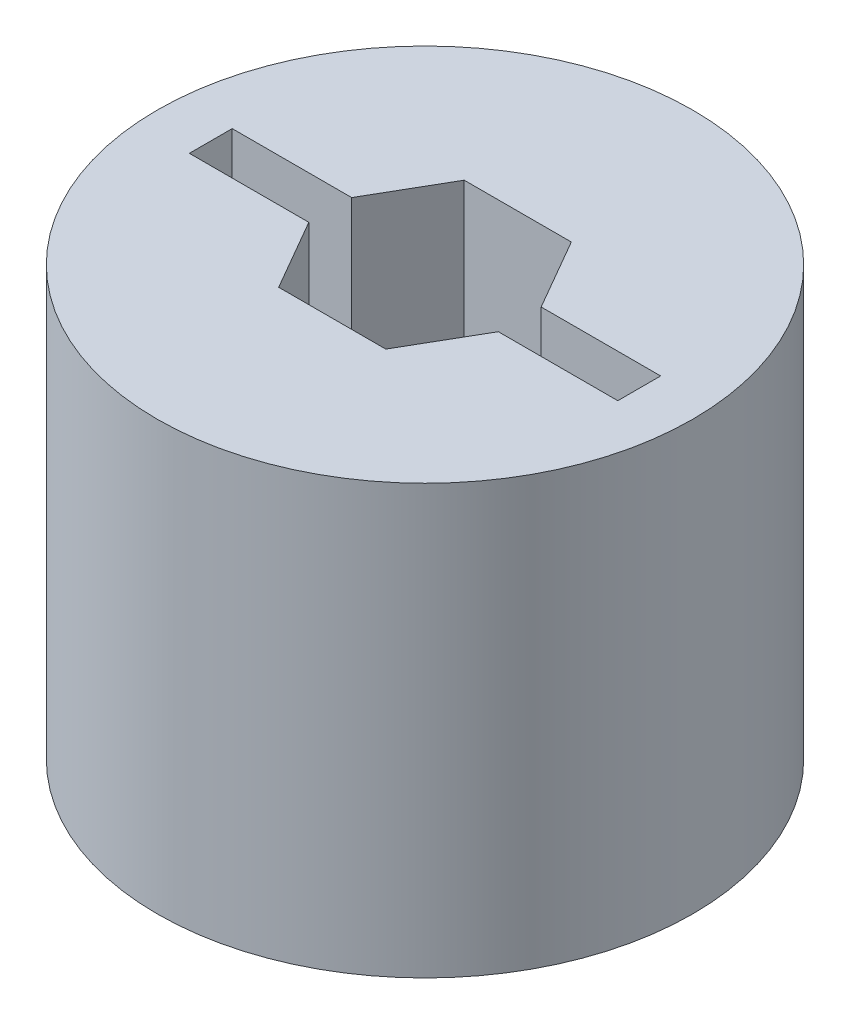
ISO-10303-21;
HEADER;
FILE_DESCRIPTION(('STEP AP214'),'2;1');
FILE_NAME('part.step','',(''),(''),'','','');
FILE_SCHEMA(('AUTOMOTIVE_DESIGN { 1 0 10303 214 1 1 1 1 }'));
ENDSEC;
DATA;
#1=APPLICATION_CONTEXT('core data for automotive mechanical design processes');
#2=APPLICATION_PROTOCOL_DEFINITION('international standard','automotive_design',2000,#1);
#3=PRODUCT_CONTEXT('',#1,'mechanical');
#4=PRODUCT('Part','Part','',(#3));
#5=PRODUCT_RELATED_PRODUCT_CATEGORY('part','',(#4));
#6=PRODUCT_DEFINITION_FORMATION('','',#4);
#7=PRODUCT_DEFINITION_CONTEXT('part definition',#1,'design');
#8=PRODUCT_DEFINITION('design','',#6,#7);
#9=PRODUCT_DEFINITION_SHAPE('','',#8);
#10=(LENGTH_UNIT() NAMED_UNIT(*) SI_UNIT(.MILLI.,.METRE.));
#11=(NAMED_UNIT(*) PLANE_ANGLE_UNIT() SI_UNIT($,.RADIAN.));
#12=(NAMED_UNIT(*) SI_UNIT($,.STERADIAN.) SOLID_ANGLE_UNIT());
#13=UNCERTAINTY_MEASURE_WITH_UNIT(LENGTH_MEASURE(1.E-05),#10,'distance_accuracy_value','');
#14=(GEOMETRIC_REPRESENTATION_CONTEXT(3) GLOBAL_UNCERTAINTY_ASSIGNED_CONTEXT((#13)) GLOBAL_UNIT_ASSIGNED_CONTEXT((#10,
#11,#12)) REPRESENTATION_CONTEXT('',''));
#15=CARTESIAN_POINT('',(0.,0.,0.));
#16=DIRECTION('',(0.,0.,1.));
#17=DIRECTION('',(1.,0.,0.));
#18=AXIS2_PLACEMENT_3D('',#15,#16,#17);
#19=CARTESIAN_POINT('',(0.,25.4,0.));
#20=DIRECTION('',(0.,-1.,0.));
#21=DIRECTION('',(0.,0.,-1.));
#22=AXIS2_PLACEMENT_3D('',#19,#20,#21);
#23=CYLINDRICAL_SURFACE('',#22,15.875);
#24=CARTESIAN_POINT('',(0.,25.4,0.));
#25=DIRECTION('',(0.,1.,0.));
#26=DIRECTION('',(0.,0.,1.));
#27=AXIS2_PLACEMENT_3D('',#24,#25,#26);
#28=CIRCLE('',#27,15.875);
#29=CARTESIAN_POINT('',(0.,25.4,-15.875));
#30=VERTEX_POINT('',#29);
#31=EDGE_CURVE('E11',#30,#30,#28,.T.);
#32=CARTESIAN_POINT('',(0.,0.,0.));
#33=DIRECTION('',(0.,1.,0.));
#34=DIRECTION('',(0.,0.,1.));
#35=AXIS2_PLACEMENT_3D('',#32,#33,#34);
#36=CIRCLE('',#35,15.875);
#37=CARTESIAN_POINT('',(0.,0.,-15.875));
#38=VERTEX_POINT('',#37);
#39=EDGE_CURVE('E35',#38,#38,#36,.T.);
#40=CARTESIAN_POINT('',(0.,25.4,-15.875));
#41=CARTESIAN_POINT('',(0.,25.1354166666667,-15.875));
#42=CARTESIAN_POINT('',(0.,24.8708333333333,-15.875));
#43=CARTESIAN_POINT('',(0.,24.3416666666667,-15.875));
#44=CARTESIAN_POINT('',(0.,24.0770833333333,-15.875));
#45=CARTESIAN_POINT('',(0.,23.5479166666667,-15.875));
#46=CARTESIAN_POINT('',(0.,23.2833333333333,-15.875));
#47=CARTESIAN_POINT('',(0.,22.7541666666667,-15.875));
#48=CARTESIAN_POINT('',(0.,22.4895833333333,-15.875));
#49=CARTESIAN_POINT('',(0.,21.9604166666667,-15.875));
#50=CARTESIAN_POINT('',(0.,21.6958333333333,-15.875));
#51=CARTESIAN_POINT('',(0.,21.1666666666667,-15.875));
#52=CARTESIAN_POINT('',(0.,20.9020833333333,-15.875));
#53=CARTESIAN_POINT('',(0.,20.3729166666667,-15.875));
#54=CARTESIAN_POINT('',(0.,20.1083333333333,-15.875));
#55=CARTESIAN_POINT('',(0.,19.5791666666667,-15.875));
#56=CARTESIAN_POINT('',(0.,19.3145833333333,-15.875));
#57=CARTESIAN_POINT('',(0.,18.7854166666667,-15.875));
#58=CARTESIAN_POINT('',(0.,18.5208333333333,-15.875));
#59=CARTESIAN_POINT('',(0.,17.9916666666667,-15.875));
#60=CARTESIAN_POINT('',(0.,17.7270833333333,-15.875));
#61=CARTESIAN_POINT('',(0.,17.1979166666667,-15.875));
#62=CARTESIAN_POINT('',(0.,16.9333333333333,-15.875));
#63=CARTESIAN_POINT('',(0.,16.4041666666667,-15.875));
#64=CARTESIAN_POINT('',(0.,16.1395833333333,-15.875));
#65=CARTESIAN_POINT('',(0.,15.6104166666667,-15.875));
#66=CARTESIAN_POINT('',(0.,15.3458333333333,-15.875));
#67=CARTESIAN_POINT('',(0.,14.8166666666667,-15.875));
#68=CARTESIAN_POINT('',(0.,14.5520833333333,-15.875));
#69=CARTESIAN_POINT('',(0.,14.0229166666667,-15.875));
#70=CARTESIAN_POINT('',(0.,13.7583333333333,-15.875));
#71=CARTESIAN_POINT('',(0.,13.2291666666667,-15.875));
#72=CARTESIAN_POINT('',(0.,12.9645833333333,-15.875));
#73=CARTESIAN_POINT('',(0.,12.4354166666667,-15.875));
#74=CARTESIAN_POINT('',(0.,12.1708333333333,-15.875));
#75=CARTESIAN_POINT('',(0.,11.6416666666667,-15.875));
#76=CARTESIAN_POINT('',(0.,11.3770833333333,-15.875));
#77=CARTESIAN_POINT('',(0.,10.8479166666667,-15.875));
#78=CARTESIAN_POINT('',(0.,10.5833333333333,-15.875));
#79=CARTESIAN_POINT('',(0.,10.0541666666667,-15.875));
#80=CARTESIAN_POINT('',(0.,9.78958333333334,-15.875));
#81=CARTESIAN_POINT('',(0.,9.26041666666667,-15.875));
#82=CARTESIAN_POINT('',(0.,8.99583333333333,-15.875));
#83=CARTESIAN_POINT('',(0.,8.46666666666667,-15.875));
#84=CARTESIAN_POINT('',(0.,8.20208333333333,-15.875));
#85=CARTESIAN_POINT('',(0.,7.67291666666667,-15.875));
#86=CARTESIAN_POINT('',(0.,7.40833333333333,-15.875));
#87=CARTESIAN_POINT('',(0.,6.87916666666667,-15.875));
#88=CARTESIAN_POINT('',(0.,6.61458333333333,-15.875));
#89=CARTESIAN_POINT('',(0.,6.08541666666667,-15.875));
#90=CARTESIAN_POINT('',(0.,5.82083333333333,-15.875));
#91=CARTESIAN_POINT('',(0.,5.29166666666667,-15.875));
#92=CARTESIAN_POINT('',(0.,5.02708333333333,-15.875));
#93=CARTESIAN_POINT('',(0.,4.49791666666667,-15.875));
#94=CARTESIAN_POINT('',(0.,4.23333333333333,-15.875));
#95=CARTESIAN_POINT('',(0.,3.70416666666667,-15.875));
#96=CARTESIAN_POINT('',(0.,3.43958333333333,-15.875));
#97=CARTESIAN_POINT('',(0.,2.91041666666667,-15.875));
#98=CARTESIAN_POINT('',(0.,2.64583333333333,-15.875));
#99=CARTESIAN_POINT('',(0.,2.11666666666667,-15.875));
#100=CARTESIAN_POINT('',(0.,1.85208333333333,-15.875));
#101=CARTESIAN_POINT('',(0.,1.32291666666667,-15.875));
#102=CARTESIAN_POINT('',(0.,1.05833333333333,-15.875));
#103=CARTESIAN_POINT('',(0.,0.529166666666666,-15.875));
#104=CARTESIAN_POINT('',(0.,0.264583333333333,-15.875));
#105=CARTESIAN_POINT('',(0.,0.,-15.875));
#106=B_SPLINE_CURVE_WITH_KNOTS('',3,(#40,#41,#42,#43,#44,#45,#46,#47,#48,#49,#50,#51,#52,#53,
#54,#55,#56,#57,#58,#59,#60,#61,#62,#63,#64,#65,#66,#67,#68,#69,#70,#71,#72,#73,#74,#75,#76,#77,
#78,#79,#80,#81,#82,#83,#84,#85,#86,#87,#88,#89,#90,#91,#92,#93,#94,#95,#96,#97,#98,#99,#100,
#101,#102,#103,#104,#105),.UNSPECIFIED.,.F.,.F.,(4,2,2,2,2,2,2,2,2,2,2,2,2,2,2,2,2,2,2,2,2,2,2,
2,2,2,2,2,2,2,2,2,4),(0.,0.793749999999999,1.5875,2.38125,3.175,3.96875,4.7625,5.55625,6.35,
7.14375,7.9375,8.73125,9.525,10.31875,11.1125,11.90625,12.7,13.49375,14.2875,15.08125,15.875,
16.66875,17.4625,18.25625,19.05,19.84375,20.6375,21.43125,22.225,23.01875,23.8125,24.60625,
25.4),.UNSPECIFIED.);
#107=EDGE_CURVE('BSEAM32',#30,#38,#106,.T.);
#108=ORIENTED_EDGE('',*,*,#31,.F.);
#109=ORIENTED_EDGE('',*,*,#39,.T.);
#110=ORIENTED_EDGE('',*,*,#107,.T.);
#111=ORIENTED_EDGE('',*,*,#107,.F.);
#112=EDGE_LOOP('',(#108,#110,#109,#111));
#113=FACE_BOUND('',#112,.T.);
#114=ADVANCED_FACE('F32',(#113),#23,.T.);
#115=CARTESIAN_POINT('',(0.,25.4,0.));
#116=DIRECTION('',(0.,1.,0.));
#117=DIRECTION('',(0.,0.,1.));
#118=AXIS2_PLACEMENT_3D('',#115,#116,#117);
#119=PLANE('',#118);
#120=DIRECTION('',(1.,0.,0.));
#121=VECTOR('',#120,1.);
#122=CARTESIAN_POINT('',(0.,25.4,1.27));
#123=LINE('',#122,#121);
#124=CARTESIAN_POINT('',(-12.7,25.4,1.27));
#125=VERTEX_POINT('',#124);
#126=CARTESIAN_POINT('',(-5.61676515812917,25.4,1.27));
#127=VERTEX_POINT('',#126);
#128=EDGE_CURVE('E46',#125,#127,#123,.T.);
#129=ORIENTED_EDGE('',*,*,#128,.F.);
#130=DIRECTION('',(0.,0.,-1.));
#131=VECTOR('',#130,1.);
#132=CARTESIAN_POINT('',(-12.7,25.4,0.));
#133=LINE('',#132,#131);
#134=CARTESIAN_POINT('',(-12.7,25.4,-1.27));
#135=VERTEX_POINT('',#134);
#136=EDGE_CURVE('E138',#125,#135,#133,.T.);
#137=ORIENTED_EDGE('',*,*,#136,.T.);
#138=DIRECTION('',(1.,0.,0.));
#139=VECTOR('',#138,1.);
#140=CARTESIAN_POINT('',(0.,25.4,-1.27));
#141=LINE('',#140,#139);
#142=CARTESIAN_POINT('',(-5.61676515812917,25.4,-1.27));
#143=VERTEX_POINT('',#142);
#144=EDGE_CURVE('E141',#135,#143,#141,.T.);
#145=ORIENTED_EDGE('',*,*,#144,.T.);
#146=DIRECTION('',(-0.5,0.,0.866025403784439));
#147=VECTOR('',#146,1.);
#148=CARTESIAN_POINT('',(-4.7625,25.4,-2.74963065701559));
#149=LINE('',#148,#147);
#150=CARTESIAN_POINT('',(-3.175,25.4,-5.49926131403118));
#151=VERTEX_POINT('',#150);
#152=EDGE_CURVE('E192',#151,#143,#149,.T.);
#153=ORIENTED_EDGE('',*,*,#152,.F.);
#154=DIRECTION('',(-1.,0.,0.));
#155=VECTOR('',#154,1.);
#156=CARTESIAN_POINT('',(0.,25.4,-5.49926131403118));
#157=LINE('',#156,#155);
#158=CARTESIAN_POINT('',(3.175,25.4,-5.49926131403118));
#159=VERTEX_POINT('',#158);
#160=EDGE_CURVE('E189',#159,#151,#157,.T.);
#161=ORIENTED_EDGE('',*,*,#160,.F.);
#162=DIRECTION('',(-0.5,0.,-0.866025403784439));
#163=VECTOR('',#162,1.);
#164=CARTESIAN_POINT('',(4.7625,25.4,-2.74963065701559));
#165=LINE('',#164,#163);
#166=CARTESIAN_POINT('',(5.61676515812917,25.4,-1.27));
#167=VERTEX_POINT('',#166);
#168=EDGE_CURVE('E186',#167,#159,#165,.T.);
#169=ORIENTED_EDGE('',*,*,#168,.F.);
#170=DIRECTION('',(1.,0.,0.));
#171=VECTOR('',#170,1.);
#172=CARTESIAN_POINT('',(0.,25.4,-1.27));
#173=LINE('',#172,#171);
#174=CARTESIAN_POINT('',(12.7,25.4,-1.27));
#175=VERTEX_POINT('',#174);
#176=EDGE_CURVE('E183',#167,#175,#173,.T.);
#177=ORIENTED_EDGE('',*,*,#176,.T.);
#178=DIRECTION('',(0.,0.,-1.));
#179=VECTOR('',#178,1.);
#180=CARTESIAN_POINT('',(12.7,25.4,0.));
#181=LINE('',#180,#179);
#182=CARTESIAN_POINT('',(12.7,25.4,1.27));
#183=VERTEX_POINT('',#182);
#184=EDGE_CURVE('E180',#183,#175,#181,.T.);
#185=ORIENTED_EDGE('',*,*,#184,.F.);
#186=DIRECTION('',(1.,0.,0.));
#187=VECTOR('',#186,1.);
#188=CARTESIAN_POINT('',(0.,25.4,1.27));
#189=LINE('',#188,#187);
#190=CARTESIAN_POINT('',(5.61676515812917,25.4,1.27));
#191=VERTEX_POINT('',#190);
#192=EDGE_CURVE('E177',#191,#183,#189,.T.);
#193=ORIENTED_EDGE('',*,*,#192,.F.);
#194=DIRECTION('',(0.5,0.,-0.866025403784439));
#195=VECTOR('',#194,1.);
#196=CARTESIAN_POINT('',(4.7625,25.4,2.74963065701559));
#197=LINE('',#196,#195);
#198=CARTESIAN_POINT('',(3.175,25.4,5.49926131403118));
#199=VERTEX_POINT('',#198);
#200=EDGE_CURVE('E174',#199,#191,#197,.T.);
#201=ORIENTED_EDGE('',*,*,#200,.F.);
#202=DIRECTION('',(1.,0.,0.));
#203=VECTOR('',#202,1.);
#204=CARTESIAN_POINT('',(0.,25.4,5.49926131403118));
#205=LINE('',#204,#203);
#206=CARTESIAN_POINT('',(-3.175,25.4,5.49926131403118));
#207=VERTEX_POINT('',#206);
#208=EDGE_CURVE('E171',#207,#199,#205,.T.);
#209=ORIENTED_EDGE('',*,*,#208,.F.);
#210=DIRECTION('',(0.5,0.,0.866025403784439));
#211=VECTOR('',#210,1.);
#212=CARTESIAN_POINT('',(-4.7625,25.4,2.74963065701559));
#213=LINE('',#212,#211);
#214=EDGE_CURVE('E169',#127,#207,#213,.T.);
#215=ORIENTED_EDGE('',*,*,#214,.F.);
#216=EDGE_LOOP('',(#129,#137,#145,#153,#161,#169,#177,#185,#193,#201,#209,#215));
#217=FACE_BOUND('',#216,.T.);
#218=ORIENTED_EDGE('',*,*,#31,.T.);
#219=EDGE_LOOP('',(#218));
#220=FACE_BOUND('',#219,.T.);
#221=ADVANCED_FACE('F221',(#217,#220),#119,.T.);
#222=CARTESIAN_POINT('',(0.,0.,0.));
#223=DIRECTION('',(0.,1.,0.));
#224=DIRECTION('',(0.,0.,1.));
#225=AXIS2_PLACEMENT_3D('',#222,#223,#224);
#226=PLANE('',#225);
#227=DIRECTION('',(0.,0.,-1.));
#228=VECTOR('',#227,1.);
#229=CARTESIAN_POINT('',(-12.7,0.,0.));
#230=LINE('',#229,#228);
#231=CARTESIAN_POINT('',(-12.7,0.,1.27));
#232=VERTEX_POINT('',#231);
#233=CARTESIAN_POINT('',(-12.7,0.,-1.27));
#234=VERTEX_POINT('',#233);
#235=EDGE_CURVE('E128',#232,#234,#230,.T.);
#236=ORIENTED_EDGE('',*,*,#235,.F.);
#237=DIRECTION('',(1.,0.,0.));
#238=VECTOR('',#237,1.);
#239=CARTESIAN_POINT('',(0.,0.,1.27));
#240=LINE('',#239,#238);
#241=CARTESIAN_POINT('',(-5.61676515812917,0.,1.27));
#242=VERTEX_POINT('',#241);
#243=EDGE_CURVE('E122',#232,#242,#240,.T.);
#244=ORIENTED_EDGE('',*,*,#243,.T.);
#245=DIRECTION('',(0.5,0.,0.866025403784439));
#246=VECTOR('',#245,1.);
#247=CARTESIAN_POINT('',(-4.7625,0.,2.74963065701559));
#248=LINE('',#247,#246);
#249=CARTESIAN_POINT('',(-3.175,0.,5.49926131403118));
#250=VERTEX_POINT('',#249);
#251=EDGE_CURVE('E131',#242,#250,#248,.T.);
#252=ORIENTED_EDGE('',*,*,#251,.T.);
#253=DIRECTION('',(1.,0.,0.));
#254=VECTOR('',#253,1.);
#255=CARTESIAN_POINT('',(0.,0.,5.49926131403118));
#256=LINE('',#255,#254);
#257=CARTESIAN_POINT('',(3.175,0.,5.49926131403118));
#258=VERTEX_POINT('',#257);
#259=EDGE_CURVE('E54',#250,#258,#256,.T.);
#260=ORIENTED_EDGE('',*,*,#259,.T.);
#261=DIRECTION('',(0.5,0.,-0.866025403784439));
#262=VECTOR('',#261,1.);
#263=CARTESIAN_POINT('',(4.7625,0.,2.74963065701559));
#264=LINE('',#263,#262);
#265=CARTESIAN_POINT('',(5.61676515812917,0.,1.27));
#266=VERTEX_POINT('',#265);
#267=EDGE_CURVE('E145',#258,#266,#264,.T.);
#268=ORIENTED_EDGE('',*,*,#267,.T.);
#269=DIRECTION('',(1.,0.,0.));
#270=VECTOR('',#269,1.);
#271=CARTESIAN_POINT('',(0.,0.,1.27));
#272=LINE('',#271,#270);
#273=CARTESIAN_POINT('',(12.7,0.,1.27));
#274=VERTEX_POINT('',#273);
#275=EDGE_CURVE('E148',#266,#274,#272,.T.);
#276=ORIENTED_EDGE('',*,*,#275,.T.);
#277=DIRECTION('',(0.,0.,-1.));
#278=VECTOR('',#277,1.);
#279=CARTESIAN_POINT('',(12.7,0.,0.));
#280=LINE('',#279,#278);
#281=CARTESIAN_POINT('',(12.7,0.,-1.27));
#282=VERTEX_POINT('',#281);
#283=EDGE_CURVE('E151',#274,#282,#280,.T.);
#284=ORIENTED_EDGE('',*,*,#283,.T.);
#285=DIRECTION('',(1.,0.,0.));
#286=VECTOR('',#285,1.);
#287=CARTESIAN_POINT('',(0.,0.,-1.27));
#288=LINE('',#287,#286);
#289=CARTESIAN_POINT('',(5.61676515812917,0.,-1.27));
#290=VERTEX_POINT('',#289);
#291=EDGE_CURVE('E154',#290,#282,#288,.T.);
#292=ORIENTED_EDGE('',*,*,#291,.F.);
#293=DIRECTION('',(-0.5,0.,-0.866025403784439));
#294=VECTOR('',#293,1.);
#295=CARTESIAN_POINT('',(4.7625,0.,-2.74963065701559));
#296=LINE('',#295,#294);
#297=CARTESIAN_POINT('',(3.175,0.,-5.49926131403118));
#298=VERTEX_POINT('',#297);
#299=EDGE_CURVE('E156',#290,#298,#296,.T.);
#300=ORIENTED_EDGE('',*,*,#299,.T.);
#301=DIRECTION('',(-1.,0.,0.));
#302=VECTOR('',#301,1.);
#303=CARTESIAN_POINT('',(0.,0.,-5.49926131403118));
#304=LINE('',#303,#302);
#305=CARTESIAN_POINT('',(-3.175,0.,-5.49926131403118));
#306=VERTEX_POINT('',#305);
#307=EDGE_CURVE('E159',#298,#306,#304,.T.);
#308=ORIENTED_EDGE('',*,*,#307,.T.);
#309=DIRECTION('',(-0.5,0.,0.866025403784439));
#310=VECTOR('',#309,1.);
#311=CARTESIAN_POINT('',(-4.7625,0.,-2.74963065701559));
#312=LINE('',#311,#310);
#313=CARTESIAN_POINT('',(-5.61676515812917,0.,-1.27));
#314=VERTEX_POINT('',#313);
#315=EDGE_CURVE('E162',#306,#314,#312,.T.);
#316=ORIENTED_EDGE('',*,*,#315,.T.);
#317=DIRECTION('',(1.,0.,0.));
#318=VECTOR('',#317,1.);
#319=CARTESIAN_POINT('',(0.,0.,-1.27));
#320=LINE('',#319,#318);
#321=EDGE_CURVE('E165',#234,#314,#320,.T.);
#322=ORIENTED_EDGE('',*,*,#321,.F.);
#323=EDGE_LOOP('',(#236,#244,#252,#260,#268,#276,#284,#292,#300,#308,#316,#322));
#324=FACE_BOUND('',#323,.T.);
#325=ORIENTED_EDGE('',*,*,#39,.F.);
#326=EDGE_LOOP('',(#325));
#327=FACE_BOUND('',#326,.T.);
#328=ADVANCED_FACE('F135',(#324,#327),#226,.F.);
#329=CARTESIAN_POINT('',(0.,0.,1.27));
#330=DIRECTION('',(0.,0.,1.));
#331=DIRECTION('',(1.,0.,0.));
#332=AXIS2_PLACEMENT_3D('',#329,#330,#331);
#333=PLANE('',#332);
#334=ORIENTED_EDGE('',*,*,#128,.T.);
#335=DIRECTION('',(0.,1.,0.));
#336=VECTOR('',#335,1.);
#337=CARTESIAN_POINT('',(-5.61676515812917,0.,1.27));
#338=LINE('',#337,#336);
#339=EDGE_CURVE('E118',#242,#127,#338,.T.);
#340=ORIENTED_EDGE('',*,*,#339,.F.);
#341=ORIENTED_EDGE('',*,*,#243,.F.);
#342=DIRECTION('',(0.,1.,0.));
#343=VECTOR('',#342,1.);
#344=CARTESIAN_POINT('',(-12.7,0.,1.27));
#345=LINE('',#344,#343);
#346=EDGE_CURVE('E197',#232,#125,#345,.T.);
#347=ORIENTED_EDGE('',*,*,#346,.T.);
#348=EDGE_LOOP('',(#334,#340,#341,#347));
#349=FACE_BOUND('',#348,.T.);
#350=ADVANCED_FACE('F120',(#349),#333,.F.);
#351=CARTESIAN_POINT('',(-12.7,0.,0.));
#352=DIRECTION('',(1.,0.,0.));
#353=DIRECTION('',(0.,0.,-1.));
#354=AXIS2_PLACEMENT_3D('',#351,#352,#353);
#355=PLANE('',#354);
#356=ORIENTED_EDGE('',*,*,#136,.F.);
#357=ORIENTED_EDGE('',*,*,#346,.F.);
#358=ORIENTED_EDGE('',*,*,#235,.T.);
#359=DIRECTION('',(0.,1.,0.));
#360=VECTOR('',#359,1.);
#361=CARTESIAN_POINT('',(-12.7,0.,-1.27));
#362=LINE('',#361,#360);
#363=EDGE_CURVE('E199',#234,#135,#362,.T.);
#364=ORIENTED_EDGE('',*,*,#363,.T.);
#365=EDGE_LOOP('',(#356,#357,#358,#364));
#366=FACE_BOUND('',#365,.T.);
#367=ADVANCED_FACE('F258',(#366),#355,.T.);
#368=CARTESIAN_POINT('',(0.,0.,-1.27));
#369=DIRECTION('',(0.,0.,1.));
#370=DIRECTION('',(1.,0.,0.));
#371=AXIS2_PLACEMENT_3D('',#368,#369,#370);
#372=PLANE('',#371);
#373=ORIENTED_EDGE('',*,*,#144,.F.);
#374=ORIENTED_EDGE('',*,*,#363,.F.);
#375=ORIENTED_EDGE('',*,*,#321,.T.);
#376=DIRECTION('',(0.,1.,0.));
#377=VECTOR('',#376,1.);
#378=CARTESIAN_POINT('',(-5.61676515812917,0.,-1.27));
#379=LINE('',#378,#377);
#380=EDGE_CURVE('E201',#314,#143,#379,.T.);
#381=ORIENTED_EDGE('',*,*,#380,.T.);
#382=EDGE_LOOP('',(#373,#374,#375,#381));
#383=FACE_BOUND('',#382,.T.);
#384=ADVANCED_FACE('F255',(#383),#372,.T.);
#385=CARTESIAN_POINT('',(-4.7625,0.,-2.74963065701559));
#386=DIRECTION('',(-0.866025403784439,0.,-0.5));
#387=DIRECTION('',(-0.5,0.,0.866025403784439));
#388=AXIS2_PLACEMENT_3D('',#385,#386,#387);
#389=PLANE('',#388);
#390=ORIENTED_EDGE('',*,*,#152,.T.);
#391=ORIENTED_EDGE('',*,*,#380,.F.);
#392=ORIENTED_EDGE('',*,*,#315,.F.);
#393=DIRECTION('',(0.,1.,0.));
#394=VECTOR('',#393,1.);
#395=CARTESIAN_POINT('',(-3.175,0.,-5.49926131403118));
#396=LINE('',#395,#394);
#397=EDGE_CURVE('E203',#306,#151,#396,.T.);
#398=ORIENTED_EDGE('',*,*,#397,.T.);
#399=EDGE_LOOP('',(#390,#391,#392,#398));
#400=FACE_BOUND('',#399,.T.);
#401=ADVANCED_FACE('F251',(#400),#389,.F.);
#402=CARTESIAN_POINT('',(0.,0.,-5.49926131403118));
#403=DIRECTION('',(0.,0.,-1.));
#404=DIRECTION('',(-1.,0.,0.));
#405=AXIS2_PLACEMENT_3D('',#402,#403,#404);
#406=PLANE('',#405);
#407=ORIENTED_EDGE('',*,*,#160,.T.);
#408=ORIENTED_EDGE('',*,*,#397,.F.);
#409=ORIENTED_EDGE('',*,*,#307,.F.);
#410=DIRECTION('',(0.,1.,0.));
#411=VECTOR('',#410,1.);
#412=CARTESIAN_POINT('',(3.175,0.,-5.49926131403118));
#413=LINE('',#412,#411);
#414=EDGE_CURVE('E205',#298,#159,#413,.T.);
#415=ORIENTED_EDGE('',*,*,#414,.T.);
#416=EDGE_LOOP('',(#407,#408,#409,#415));
#417=FACE_BOUND('',#416,.T.);
#418=ADVANCED_FACE('F246',(#417),#406,.F.);
#419=CARTESIAN_POINT('',(4.7625,0.,-2.74963065701559));
#420=DIRECTION('',(0.866025403784438,0.,-0.5));
#421=DIRECTION('',(-0.5,0.,-0.866025403784439));
#422=AXIS2_PLACEMENT_3D('',#419,#420,#421);
#423=PLANE('',#422);
#424=ORIENTED_EDGE('',*,*,#168,.T.);
#425=ORIENTED_EDGE('',*,*,#414,.F.);
#426=ORIENTED_EDGE('',*,*,#299,.F.);
#427=DIRECTION('',(0.,1.,0.));
#428=VECTOR('',#427,1.);
#429=CARTESIAN_POINT('',(5.61676515812917,0.,-1.27));
#430=LINE('',#429,#428);
#431=EDGE_CURVE('E207',#290,#167,#430,.T.);
#432=ORIENTED_EDGE('',*,*,#431,.T.);
#433=EDGE_LOOP('',(#424,#425,#426,#432));
#434=FACE_BOUND('',#433,.T.);
#435=ADVANCED_FACE('F243',(#434),#423,.F.);
#436=CARTESIAN_POINT('',(0.,0.,-1.27));
#437=DIRECTION('',(0.,0.,1.));
#438=DIRECTION('',(1.,0.,0.));
#439=AXIS2_PLACEMENT_3D('',#436,#437,#438);
#440=PLANE('',#439);
#441=ORIENTED_EDGE('',*,*,#176,.F.);
#442=ORIENTED_EDGE('',*,*,#431,.F.);
#443=ORIENTED_EDGE('',*,*,#291,.T.);
#444=DIRECTION('',(0.,1.,0.));
#445=VECTOR('',#444,1.);
#446=CARTESIAN_POINT('',(12.7,0.,-1.27));
#447=LINE('',#446,#445);
#448=EDGE_CURVE('E209',#282,#175,#447,.T.);
#449=ORIENTED_EDGE('',*,*,#448,.T.);
#450=EDGE_LOOP('',(#441,#442,#443,#449));
#451=FACE_BOUND('',#450,.T.);
#452=ADVANCED_FACE('F238',(#451),#440,.T.);
#453=CARTESIAN_POINT('',(12.7,0.,0.));
#454=DIRECTION('',(1.,0.,0.));
#455=DIRECTION('',(0.,0.,-1.));
#456=AXIS2_PLACEMENT_3D('',#453,#454,#455);
#457=PLANE('',#456);
#458=ORIENTED_EDGE('',*,*,#184,.T.);
#459=ORIENTED_EDGE('',*,*,#448,.F.);
#460=ORIENTED_EDGE('',*,*,#283,.F.);
#461=DIRECTION('',(0.,1.,0.));
#462=VECTOR('',#461,1.);
#463=CARTESIAN_POINT('',(12.7,0.,1.27));
#464=LINE('',#463,#462);
#465=EDGE_CURVE('E211',#274,#183,#464,.T.);
#466=ORIENTED_EDGE('',*,*,#465,.T.);
#467=EDGE_LOOP('',(#458,#459,#460,#466));
#468=FACE_BOUND('',#467,.T.);
#469=ADVANCED_FACE('F235',(#468),#457,.F.);
#470=CARTESIAN_POINT('',(0.,0.,1.27));
#471=DIRECTION('',(0.,0.,1.));
#472=DIRECTION('',(1.,0.,0.));
#473=AXIS2_PLACEMENT_3D('',#470,#471,#472);
#474=PLANE('',#473);
#475=ORIENTED_EDGE('',*,*,#192,.T.);
#476=ORIENTED_EDGE('',*,*,#465,.F.);
#477=ORIENTED_EDGE('',*,*,#275,.F.);
#478=DIRECTION('',(0.,1.,0.));
#479=VECTOR('',#478,1.);
#480=CARTESIAN_POINT('',(5.61676515812917,0.,1.27));
#481=LINE('',#480,#479);
#482=EDGE_CURVE('E213',#266,#191,#481,.T.);
#483=ORIENTED_EDGE('',*,*,#482,.T.);
#484=EDGE_LOOP('',(#475,#476,#477,#483));
#485=FACE_BOUND('',#484,.T.);
#486=ADVANCED_FACE('F232',(#485),#474,.F.);
#487=CARTESIAN_POINT('',(4.7625,0.,2.74963065701559));
#488=DIRECTION('',(0.866025403784439,0.,0.5));
#489=DIRECTION('',(0.5,0.,-0.866025403784439));
#490=AXIS2_PLACEMENT_3D('',#487,#488,#489);
#491=PLANE('',#490);
#492=ORIENTED_EDGE('',*,*,#200,.T.);
#493=ORIENTED_EDGE('',*,*,#482,.F.);
#494=ORIENTED_EDGE('',*,*,#267,.F.);
#495=DIRECTION('',(0.,1.,0.));
#496=VECTOR('',#495,1.);
#497=CARTESIAN_POINT('',(3.175,0.,5.49926131403118));
#498=LINE('',#497,#496);
#499=EDGE_CURVE('E215',#258,#199,#498,.T.);
#500=ORIENTED_EDGE('',*,*,#499,.T.);
#501=EDGE_LOOP('',(#492,#493,#494,#500));
#502=FACE_BOUND('',#501,.T.);
#503=ADVANCED_FACE('F226',(#502),#491,.F.);
#504=CARTESIAN_POINT('',(0.,0.,5.49926131403118));
#505=DIRECTION('',(0.,0.,1.));
#506=DIRECTION('',(1.,0.,0.));
#507=AXIS2_PLACEMENT_3D('',#504,#505,#506);
#508=PLANE('',#507);
#509=ORIENTED_EDGE('',*,*,#208,.T.);
#510=ORIENTED_EDGE('',*,*,#499,.F.);
#511=ORIENTED_EDGE('',*,*,#259,.F.);
#512=DIRECTION('',(0.,1.,0.));
#513=VECTOR('',#512,1.);
#514=CARTESIAN_POINT('',(-3.175,0.,5.49926131403118));
#515=LINE('',#514,#513);
#516=EDGE_CURVE('E127',#250,#207,#515,.T.);
#517=ORIENTED_EDGE('',*,*,#516,.T.);
#518=EDGE_LOOP('',(#509,#510,#511,#517));
#519=FACE_BOUND('',#518,.T.);
#520=ADVANCED_FACE('F217',(#519),#508,.F.);
#521=CARTESIAN_POINT('',(-4.7625,0.,2.74963065701559));
#522=DIRECTION('',(-0.866025403784439,0.,0.5));
#523=DIRECTION('',(0.5,0.,0.866025403784439));
#524=AXIS2_PLACEMENT_3D('',#521,#522,#523);
#525=PLANE('',#524);
#526=ORIENTED_EDGE('',*,*,#214,.T.);
#527=ORIENTED_EDGE('',*,*,#516,.F.);
#528=ORIENTED_EDGE('',*,*,#251,.F.);
#529=ORIENTED_EDGE('',*,*,#339,.T.);
#530=EDGE_LOOP('',(#526,#527,#528,#529));
#531=FACE_BOUND('',#530,.T.);
#532=ADVANCED_FACE('F132',(#531),#525,.F.);
#533=CLOSED_SHELL('',(#114,#221,#328,#350,#367,#384,#401,#418,#435,#452,#469,#486,#503,#520,#532));
#534=MANIFOLD_SOLID_BREP('B2',#533);
#535=ADVANCED_BREP_SHAPE_REPRESENTATION('',(#18,#534),#14);
#536=SHAPE_DEFINITION_REPRESENTATION(#9,#535);
ENDSEC;
END-ISO-10303-21;
